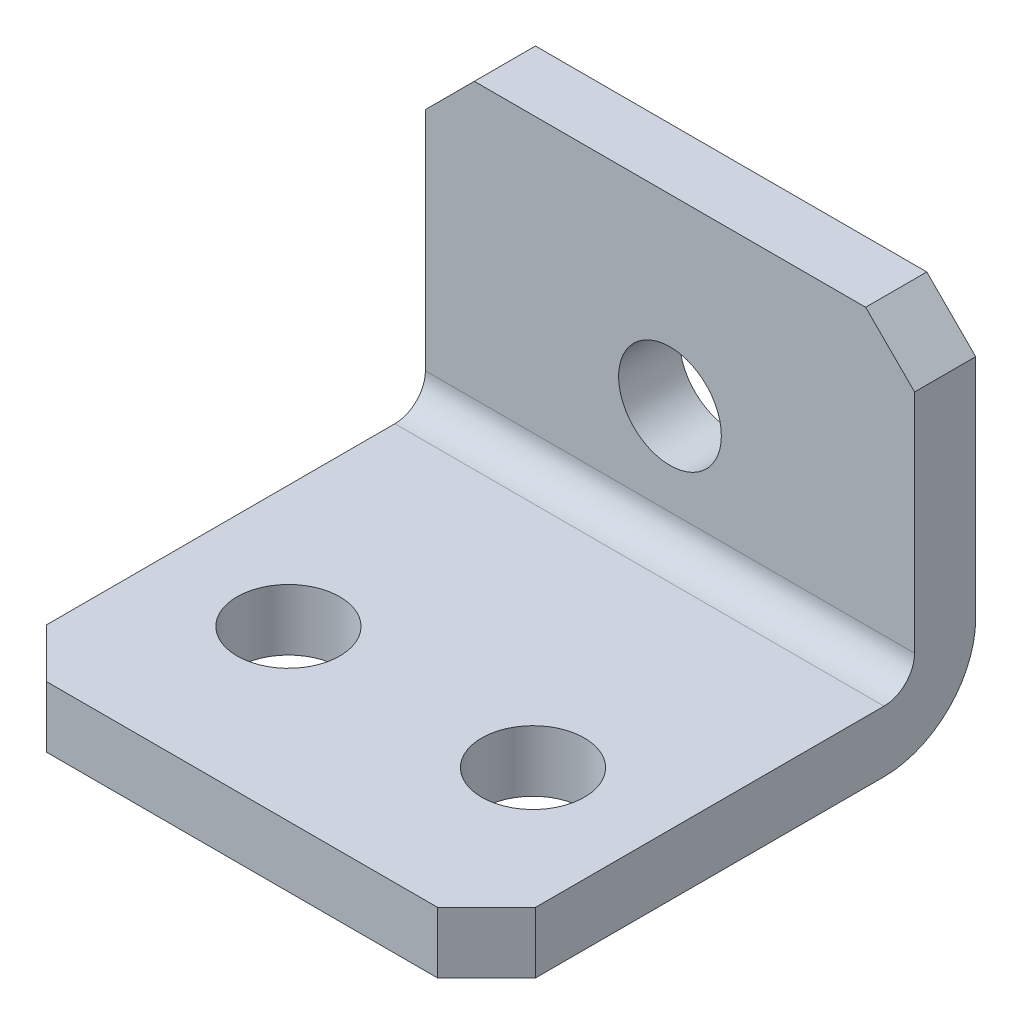
ISO-10303-21;
HEADER;
FILE_DESCRIPTION(('STEP AP214'),'2;1');
FILE_NAME('part.step','',(''),(''),'','','');
FILE_SCHEMA(('AUTOMOTIVE_DESIGN { 1 0 10303 214 1 1 1 1 }'));
ENDSEC;
DATA;
#1=APPLICATION_CONTEXT('core data for automotive mechanical design processes');
#2=APPLICATION_PROTOCOL_DEFINITION('international standard','automotive_design',2000,#1);
#3=PRODUCT_CONTEXT('',#1,'mechanical');
#4=PRODUCT('Part','Part','',(#3));
#5=PRODUCT_RELATED_PRODUCT_CATEGORY('part','',(#4));
#6=PRODUCT_DEFINITION_FORMATION('','',#4);
#7=PRODUCT_DEFINITION_CONTEXT('part definition',#1,'design');
#8=PRODUCT_DEFINITION('design','',#6,#7);
#9=PRODUCT_DEFINITION_SHAPE('','',#8);
#10=(LENGTH_UNIT() NAMED_UNIT(*) SI_UNIT(.MILLI.,.METRE.));
#11=(NAMED_UNIT(*) PLANE_ANGLE_UNIT() SI_UNIT($,.RADIAN.));
#12=(NAMED_UNIT(*) SI_UNIT($,.STERADIAN.) SOLID_ANGLE_UNIT());
#13=UNCERTAINTY_MEASURE_WITH_UNIT(LENGTH_MEASURE(1.E-05),#10,'distance_accuracy_value','');
#14=(GEOMETRIC_REPRESENTATION_CONTEXT(3) GLOBAL_UNCERTAINTY_ASSIGNED_CONTEXT((#13)) GLOBAL_UNIT_ASSIGNED_CONTEXT((#10,
#11,#12)) REPRESENTATION_CONTEXT('',''));
#15=CARTESIAN_POINT('',(0.,0.,0.));
#16=DIRECTION('',(0.,0.,1.));
#17=DIRECTION('',(1.,0.,0.));
#18=AXIS2_PLACEMENT_3D('',#15,#16,#17);
#19=CARTESIAN_POINT('',(0.,0.,3.17500000000001));
#20=DIRECTION('',(0.,0.,1.));
#21=DIRECTION('',(0.,-1.,0.));
#22=AXIS2_PLACEMENT_3D('',#19,#20,#21);
#23=PLANE('',#22);
#24=DIRECTION('',(0.,1.,0.));
#25=VECTOR('',#24,1.);
#26=CARTESIAN_POINT('',(-12.7,19.05,3.17499999999995));
#27=LINE('',#26,#25);
#28=CARTESIAN_POINT('',(-12.7,16.51,3.17499999999995));
#29=VERTEX_POINT('',#28);
#30=CARTESIAN_POINT('',(-12.7,4.7625,3.17499999999997));
#31=VERTEX_POINT('',#30);
#32=EDGE_CURVE('E119',#29,#31,#27,.F.);
#33=ORIENTED_EDGE('',*,*,#32,.T.);
#34=DIRECTION('',(-1.,0.,0.));
#35=VECTOR('',#34,1.);
#36=CARTESIAN_POINT('',(-12.7,4.76249999999998,3.17499999999999));
#37=LINE('',#36,#35);
#38=CARTESIAN_POINT('',(12.7,4.76249999999998,3.17499999999999));
#39=VERTEX_POINT('',#38);
#40=EDGE_CURVE('E116',#31,#39,#37,.F.);
#41=ORIENTED_EDGE('',*,*,#40,.T.);
#42=DIRECTION('',(0.,1.,0.));
#43=VECTOR('',#42,1.);
#44=CARTESIAN_POINT('',(12.7,3.17499999999999,3.17499999999999));
#45=LINE('',#44,#43);
#46=CARTESIAN_POINT('',(12.7,16.51,3.17499999999998));
#47=VERTEX_POINT('',#46);
#48=EDGE_CURVE('E103',#39,#47,#45,.T.);
#49=ORIENTED_EDGE('',*,*,#48,.T.);
#50=DIRECTION('',(0.707106781186549,-0.707106781186546,0.));
#51=VECTOR('',#50,1.);
#52=CARTESIAN_POINT('',(12.7,16.51,3.17499999999995));
#53=LINE('',#52,#51);
#54=CARTESIAN_POINT('',(10.16,19.05,3.17499999999995));
#55=VERTEX_POINT('',#54);
#56=EDGE_CURVE('E155',#47,#55,#53,.F.);
#57=ORIENTED_EDGE('',*,*,#56,.T.);
#58=DIRECTION('',(1.,0.,0.));
#59=VECTOR('',#58,1.);
#60=CARTESIAN_POINT('',(12.7,19.05,3.17499999999994));
#61=LINE('',#60,#59);
#62=CARTESIAN_POINT('',(-10.16,19.05,3.17499999999994));
#63=VERTEX_POINT('',#62);
#64=EDGE_CURVE('E113',#55,#63,#61,.F.);
#65=ORIENTED_EDGE('',*,*,#64,.T.);
#66=DIRECTION('',(0.707106781186546,0.70710678118655,0.));
#67=VECTOR('',#66,1.);
#68=CARTESIAN_POINT('',(-10.16,19.05,3.17499999999994));
#69=LINE('',#68,#67);
#70=EDGE_CURVE('E157',#63,#29,#69,.F.);
#71=ORIENTED_EDGE('',*,*,#70,.T.);
#72=EDGE_LOOP('',(#33,#41,#49,#57,#65,#71));
#73=FACE_BOUND('',#72,.T.);
#74=CARTESIAN_POINT('',(0.,9.52500000000001,3.17500000000001));
#75=DIRECTION('',(0.,0.,1.));
#76=DIRECTION('',(1.,0.,0.));
#77=AXIS2_PLACEMENT_3D('',#74,#75,#76);
#78=CIRCLE('',#77,2.667);
#79=CARTESIAN_POINT('',(2.667,9.52500000000001,3.17500000000001));
#80=VERTEX_POINT('',#79);
#81=EDGE_CURVE('E20',#80,#80,#78,.F.);
#82=ORIENTED_EDGE('',*,*,#81,.T.);
#83=EDGE_LOOP('',(#82));
#84=FACE_BOUND('',#83,.T.);
#85=ADVANCED_FACE('F17',(#73,#84),#23,.T.);
#86=CARTESIAN_POINT('',(0.,9.52500000000001,0.));
#87=DIRECTION('',(0.,0.,1.));
#88=DIRECTION('',(1.,0.,0.));
#89=AXIS2_PLACEMENT_3D('',#86,#87,#88);
#90=CYLINDRICAL_SURFACE('',#89,2.667);
#91=CARTESIAN_POINT('',(0.,9.52500000000001,0.));
#92=DIRECTION('',(0.,0.,1.));
#93=DIRECTION('',(1.,0.,0.));
#94=AXIS2_PLACEMENT_3D('',#91,#92,#93);
#95=CIRCLE('',#94,2.667);
#96=CARTESIAN_POINT('',(2.667,9.52500000000001,0.));
#97=VERTEX_POINT('',#96);
#98=EDGE_CURVE('E123',#97,#97,#95,.F.);
#99=ORIENTED_EDGE('',*,*,#98,.T.);
#100=EDGE_LOOP('',(#99));
#101=FACE_BOUND('',#100,.T.);
#102=ORIENTED_EDGE('',*,*,#81,.F.);
#103=EDGE_LOOP('',(#102));
#104=FACE_BOUND('',#103,.T.);
#105=ADVANCED_FACE('F295',(#101,#104),#90,.F.);
#106=CARTESIAN_POINT('',(-10.16,19.05,0.));
#107=DIRECTION('',(0.70710678118655,-0.707106781186546,0.));
#108=DIRECTION('',(0.707106781186546,0.70710678118655,0.));
#109=AXIS2_PLACEMENT_3D('',#106,#107,#108);
#110=PLANE('',#109);
#111=DIRECTION('',(0.,0.,-1.));
#112=VECTOR('',#111,1.);
#113=CARTESIAN_POINT('',(-12.7,16.51,0.));
#114=LINE('',#113,#112);
#115=CARTESIAN_POINT('',(-12.7,16.51,0.));
#116=VERTEX_POINT('',#115);
#117=EDGE_CURVE('E151',#116,#29,#114,.F.);
#118=ORIENTED_EDGE('',*,*,#117,.T.);
#119=ORIENTED_EDGE('',*,*,#70,.F.);
#120=DIRECTION('',(0.,0.,-1.));
#121=VECTOR('',#120,1.);
#122=CARTESIAN_POINT('',(-10.16,19.05,0.));
#123=LINE('',#122,#121);
#124=CARTESIAN_POINT('',(-10.16,19.05,0.));
#125=VERTEX_POINT('',#124);
#126=EDGE_CURVE('E153',#63,#125,#123,.T.);
#127=ORIENTED_EDGE('',*,*,#126,.T.);
#128=DIRECTION('',(-0.707106781186546,-0.707106781186549,0.));
#129=VECTOR('',#128,1.);
#130=CARTESIAN_POINT('',(-10.16,19.05,0.));
#131=LINE('',#130,#129);
#132=EDGE_CURVE('E137',#125,#116,#131,.T.);
#133=ORIENTED_EDGE('',*,*,#132,.T.);
#134=EDGE_LOOP('',(#118,#119,#127,#133));
#135=FACE_BOUND('',#134,.T.);
#136=ADVANCED_FACE('F293',(#135),#110,.F.);
#137=CARTESIAN_POINT('',(12.7,16.51,0.));
#138=DIRECTION('',(-0.707106781186546,-0.707106781186549,0.));
#139=DIRECTION('',(0.707106781186549,-0.707106781186546,0.));
#140=AXIS2_PLACEMENT_3D('',#137,#138,#139);
#141=PLANE('',#140);
#142=DIRECTION('',(0.,0.,-1.));
#143=VECTOR('',#142,1.);
#144=CARTESIAN_POINT('',(10.16,19.05,0.));
#145=LINE('',#144,#143);
#146=CARTESIAN_POINT('',(10.16,19.05,0.));
#147=VERTEX_POINT('',#146);
#148=EDGE_CURVE('E154',#147,#55,#145,.F.);
#149=ORIENTED_EDGE('',*,*,#148,.T.);
#150=ORIENTED_EDGE('',*,*,#56,.F.);
#151=DIRECTION('',(0.,0.,1.));
#152=VECTOR('',#151,1.);
#153=CARTESIAN_POINT('',(12.7,16.51,0.));
#154=LINE('',#153,#152);
#155=CARTESIAN_POINT('',(12.7,16.51,0.));
#156=VERTEX_POINT('',#155);
#157=EDGE_CURVE('E111',#47,#156,#154,.F.);
#158=ORIENTED_EDGE('',*,*,#157,.T.);
#159=DIRECTION('',(-0.707106781186549,0.707106781186546,0.));
#160=VECTOR('',#159,1.);
#161=CARTESIAN_POINT('',(12.7,16.51,0.));
#162=LINE('',#161,#160);
#163=EDGE_CURVE('E133',#156,#147,#162,.T.);
#164=ORIENTED_EDGE('',*,*,#163,.T.);
#165=EDGE_LOOP('',(#149,#150,#158,#164));
#166=FACE_BOUND('',#165,.T.);
#167=ADVANCED_FACE('F217',(#166),#141,.F.);
#168=CARTESIAN_POINT('',(12.7,19.05,0.));
#169=DIRECTION('',(0.,-1.,0.));
#170=DIRECTION('',(0.,0.,-1.));
#171=AXIS2_PLACEMENT_3D('',#168,#169,#170);
#172=PLANE('',#171);
#173=ORIENTED_EDGE('',*,*,#148,.F.);
#174=DIRECTION('',(1.,0.,0.));
#175=VECTOR('',#174,1.);
#176=CARTESIAN_POINT('',(0.,19.05,0.));
#177=LINE('',#176,#175);
#178=EDGE_CURVE('E129',#147,#125,#177,.F.);
#179=ORIENTED_EDGE('',*,*,#178,.T.);
#180=ORIENTED_EDGE('',*,*,#126,.F.);
#181=ORIENTED_EDGE('',*,*,#64,.F.);
#182=EDGE_LOOP('',(#173,#179,#180,#181));
#183=FACE_BOUND('',#182,.T.);
#184=ADVANCED_FACE('F287',(#183),#172,.F.);
#185=CARTESIAN_POINT('',(-12.7,4.76249999999998,4.76249999999999));
#186=DIRECTION('',(-1.,0.,0.));
#187=DIRECTION('',(0.,0.,1.));
#188=AXIS2_PLACEMENT_3D('',#185,#186,#187);
#189=CYLINDRICAL_SURFACE('',#188,1.5875);
#190=CARTESIAN_POINT('',(12.7,4.76249999999998,4.76249999999999));
#191=DIRECTION('',(-1.,0.,0.));
#192=DIRECTION('',(0.,0.,1.));
#193=AXIS2_PLACEMENT_3D('',#190,#191,#192);
#194=CIRCLE('',#193,1.5875);
#195=CARTESIAN_POINT('',(12.7,3.17499999999999,4.76249999999999));
#196=VERTEX_POINT('',#195);
#197=EDGE_CURVE('E108',#39,#196,#194,.T.);
#198=ORIENTED_EDGE('',*,*,#197,.F.);
#199=ORIENTED_EDGE('',*,*,#40,.F.);
#200=CARTESIAN_POINT('',(-12.7,4.76249999999998,4.76249999999999));
#201=DIRECTION('',(-1.,0.,0.));
#202=DIRECTION('',(0.,0.,1.));
#203=AXIS2_PLACEMENT_3D('',#200,#201,#202);
#204=CIRCLE('',#203,1.5875);
#205=CARTESIAN_POINT('',(-12.7,3.17499999999999,4.76249999999999));
#206=VERTEX_POINT('',#205);
#207=EDGE_CURVE('E128',#31,#206,#204,.T.);
#208=ORIENTED_EDGE('',*,*,#207,.T.);
#209=DIRECTION('',(1.,0.,0.));
#210=VECTOR('',#209,1.);
#211=CARTESIAN_POINT('',(0.,3.175,4.76249999999999));
#212=LINE('',#211,#210);
#213=EDGE_CURVE('E126',#196,#206,#212,.F.);
#214=ORIENTED_EDGE('',*,*,#213,.F.);
#215=EDGE_LOOP('',(#198,#199,#208,#214));
#216=FACE_BOUND('',#215,.T.);
#217=ADVANCED_FACE('F125',(#216),#189,.F.);
#218=CARTESIAN_POINT('',(0.,0.,0.));
#219=DIRECTION('',(0.,0.,1.));
#220=DIRECTION('',(0.,-1.,0.));
#221=AXIS2_PLACEMENT_3D('',#218,#219,#220);
#222=PLANE('',#221);
#223=ORIENTED_EDGE('',*,*,#163,.F.);
#224=DIRECTION('',(0.,-1.,0.));
#225=VECTOR('',#224,1.);
#226=CARTESIAN_POINT('',(12.7,0.,0.));
#227=LINE('',#226,#225);
#228=CARTESIAN_POINT('',(12.7,4.76249999999999,0.));
#229=VERTEX_POINT('',#228);
#230=EDGE_CURVE('E147',#229,#156,#227,.F.);
#231=ORIENTED_EDGE('',*,*,#230,.F.);
#232=DIRECTION('',(-1.,0.,0.));
#233=VECTOR('',#232,1.);
#234=CARTESIAN_POINT('',(-12.7,4.76250000000002,0.));
#235=LINE('',#234,#233);
#236=CARTESIAN_POINT('',(-12.7,4.76249999999999,0.));
#237=VERTEX_POINT('',#236);
#238=EDGE_CURVE('E175',#237,#229,#235,.F.);
#239=ORIENTED_EDGE('',*,*,#238,.F.);
#240=DIRECTION('',(0.,-1.,0.));
#241=VECTOR('',#240,1.);
#242=CARTESIAN_POINT('',(-12.7,0.,0.));
#243=LINE('',#242,#241);
#244=EDGE_CURVE('E141',#116,#237,#243,.T.);
#245=ORIENTED_EDGE('',*,*,#244,.F.);
#246=ORIENTED_EDGE('',*,*,#132,.F.);
#247=ORIENTED_EDGE('',*,*,#178,.F.);
#248=EDGE_LOOP('',(#223,#231,#239,#245,#246,#247));
#249=FACE_BOUND('',#248,.T.);
#250=ORIENTED_EDGE('',*,*,#98,.F.);
#251=EDGE_LOOP('',(#250));
#252=FACE_BOUND('',#251,.T.);
#253=ADVANCED_FACE('F220',(#249,#252),#222,.F.);
#254=CARTESIAN_POINT('',(0.,3.175,0.));
#255=DIRECTION('',(0.,1.,0.));
#256=DIRECTION('',(0.,0.,1.));
#257=AXIS2_PLACEMENT_3D('',#254,#255,#256);
#258=PLANE('',#257);
#259=DIRECTION('',(0.,0.,-1.));
#260=VECTOR('',#259,1.);
#261=CARTESIAN_POINT('',(12.7,3.175,0.));
#262=LINE('',#261,#260);
#263=CARTESIAN_POINT('',(12.7,3.175,22.86));
#264=VERTEX_POINT('',#263);
#265=EDGE_CURVE('E205',#196,#264,#262,.F.);
#266=ORIENTED_EDGE('',*,*,#265,.F.);
#267=ORIENTED_EDGE('',*,*,#213,.T.);
#268=DIRECTION('',(0.,0.,1.));
#269=VECTOR('',#268,1.);
#270=CARTESIAN_POINT('',(-12.7,3.175,0.));
#271=LINE('',#270,#269);
#272=CARTESIAN_POINT('',(-12.7,3.175,22.86));
#273=VERTEX_POINT('',#272);
#274=EDGE_CURVE('E174',#273,#206,#271,.F.);
#275=ORIENTED_EDGE('',*,*,#274,.F.);
#276=DIRECTION('',(-0.707106781186549,0.,-0.707106781186546));
#277=VECTOR('',#276,1.);
#278=CARTESIAN_POINT('',(-12.7,3.175,22.86));
#279=LINE('',#278,#277);
#280=CARTESIAN_POINT('',(-10.16,3.175,25.4));
#281=VERTEX_POINT('',#280);
#282=EDGE_CURVE('E193',#273,#281,#279,.F.);
#283=ORIENTED_EDGE('',*,*,#282,.T.);
#284=DIRECTION('',(1.,0.,0.));
#285=VECTOR('',#284,1.);
#286=CARTESIAN_POINT('',(-12.7,3.175,25.4));
#287=LINE('',#286,#285);
#288=CARTESIAN_POINT('',(10.16,3.175,25.4));
#289=VERTEX_POINT('',#288);
#290=EDGE_CURVE('E196',#289,#281,#287,.F.);
#291=ORIENTED_EDGE('',*,*,#290,.F.);
#292=DIRECTION('',(-0.707106781186546,0.,0.70710678118655));
#293=VECTOR('',#292,1.);
#294=CARTESIAN_POINT('',(10.16,3.175,25.4));
#295=LINE('',#294,#293);
#296=EDGE_CURVE('E181',#289,#264,#295,.F.);
#297=ORIENTED_EDGE('',*,*,#296,.T.);
#298=EDGE_LOOP('',(#266,#267,#275,#283,#291,#297));
#299=FACE_BOUND('',#298,.T.);
#300=CARTESIAN_POINT('',(-6.35,3.175,16.637));
#301=DIRECTION('',(0.,1.,0.));
#302=DIRECTION('',(0.,0.,1.));
#303=AXIS2_PLACEMENT_3D('',#300,#301,#302);
#304=CIRCLE('',#303,2.667);
#305=CARTESIAN_POINT('',(-6.35,3.175,19.304));
#306=VERTEX_POINT('',#305);
#307=EDGE_CURVE('E179',#306,#306,#304,.F.);
#308=ORIENTED_EDGE('',*,*,#307,.T.);
#309=EDGE_LOOP('',(#308));
#310=FACE_BOUND('',#309,.T.);
#311=CARTESIAN_POINT('',(6.35,3.175,16.637));
#312=DIRECTION('',(0.,1.,0.));
#313=DIRECTION('',(0.,0.,1.));
#314=AXIS2_PLACEMENT_3D('',#311,#312,#313);
#315=CIRCLE('',#314,2.667);
#316=CARTESIAN_POINT('',(6.35,3.175,19.304));
#317=VERTEX_POINT('',#316);
#318=EDGE_CURVE('E182',#317,#317,#315,.F.);
#319=ORIENTED_EDGE('',*,*,#318,.T.);
#320=EDGE_LOOP('',(#319));
#321=FACE_BOUND('',#320,.T.);
#322=ADVANCED_FACE('F251',(#299,#310,#321),#258,.T.);
#323=CARTESIAN_POINT('',(6.35,3.175,16.637));
#324=DIRECTION('',(0.,1.,0.));
#325=DIRECTION('',(0.,0.,1.));
#326=AXIS2_PLACEMENT_3D('',#323,#324,#325);
#327=CYLINDRICAL_SURFACE('',#326,2.667);
#328=CARTESIAN_POINT('',(6.35,0.,16.637));
#329=DIRECTION('',(0.,1.,0.));
#330=DIRECTION('',(0.,0.,1.));
#331=AXIS2_PLACEMENT_3D('',#328,#329,#330);
#332=CIRCLE('',#331,2.667);
#333=CARTESIAN_POINT('',(6.35,0.,19.304));
#334=VERTEX_POINT('',#333);
#335=EDGE_CURVE('E168',#334,#334,#332,.F.);
#336=ORIENTED_EDGE('',*,*,#335,.T.);
#337=EDGE_LOOP('',(#336));
#338=FACE_BOUND('',#337,.T.);
#339=ORIENTED_EDGE('',*,*,#318,.F.);
#340=EDGE_LOOP('',(#339));
#341=FACE_BOUND('',#340,.T.);
#342=ADVANCED_FACE('F276',(#338,#341),#327,.F.);
#343=CARTESIAN_POINT('',(-6.35,3.175,16.637));
#344=DIRECTION('',(0.,1.,0.));
#345=DIRECTION('',(0.,0.,1.));
#346=AXIS2_PLACEMENT_3D('',#343,#344,#345);
#347=CYLINDRICAL_SURFACE('',#346,2.667);
#348=CARTESIAN_POINT('',(-6.35,0.,16.637));
#349=DIRECTION('',(0.,1.,0.));
#350=DIRECTION('',(0.,0.,1.));
#351=AXIS2_PLACEMENT_3D('',#348,#349,#350);
#352=CIRCLE('',#351,2.667);
#353=CARTESIAN_POINT('',(-6.35,0.,19.304));
#354=VERTEX_POINT('',#353);
#355=EDGE_CURVE('E164',#354,#354,#352,.F.);
#356=ORIENTED_EDGE('',*,*,#355,.T.);
#357=EDGE_LOOP('',(#356));
#358=FACE_BOUND('',#357,.T.);
#359=ORIENTED_EDGE('',*,*,#307,.F.);
#360=EDGE_LOOP('',(#359));
#361=FACE_BOUND('',#360,.T.);
#362=ADVANCED_FACE('F273',(#358,#361),#347,.F.);
#363=CARTESIAN_POINT('',(10.16,3.175,25.4));
#364=DIRECTION('',(-0.70710678118655,0.,-0.707106781186546));
#365=DIRECTION('',(-0.707106781186546,0.,0.70710678118655));
#366=AXIS2_PLACEMENT_3D('',#363,#364,#365);
#367=PLANE('',#366);
#368=DIRECTION('',(0.,1.,0.));
#369=VECTOR('',#368,1.);
#370=CARTESIAN_POINT('',(12.7,3.175,22.86));
#371=LINE('',#370,#369);
#372=CARTESIAN_POINT('',(12.7,0.,22.86));
#373=VERTEX_POINT('',#372);
#374=EDGE_CURVE('E178',#264,#373,#371,.F.);
#375=ORIENTED_EDGE('',*,*,#374,.F.);
#376=ORIENTED_EDGE('',*,*,#296,.F.);
#377=DIRECTION('',(0.,1.,0.));
#378=VECTOR('',#377,1.);
#379=CARTESIAN_POINT('',(10.16,3.175,25.4));
#380=LINE('',#379,#378);
#381=CARTESIAN_POINT('',(10.16,0.,25.4));
#382=VERTEX_POINT('',#381);
#383=EDGE_CURVE('E171',#382,#289,#380,.T.);
#384=ORIENTED_EDGE('',*,*,#383,.F.);
#385=DIRECTION('',(0.707106781186546,0.,-0.707106781186549));
#386=VECTOR('',#385,1.);
#387=CARTESIAN_POINT('',(10.16,0.,25.4));
#388=LINE('',#387,#386);
#389=EDGE_CURVE('E167',#382,#373,#388,.T.);
#390=ORIENTED_EDGE('',*,*,#389,.T.);
#391=EDGE_LOOP('',(#375,#376,#384,#390));
#392=FACE_BOUND('',#391,.T.);
#393=ADVANCED_FACE('F246',(#392),#367,.F.);
#394=CARTESIAN_POINT('',(12.7,3.175,0.));
#395=DIRECTION('',(1.,0.,0.));
#396=DIRECTION('',(0.,0.,-1.));
#397=AXIS2_PLACEMENT_3D('',#394,#395,#396);
#398=PLANE('',#397);
#399=DIRECTION('',(0.,0.,1.));
#400=VECTOR('',#399,1.);
#401=CARTESIAN_POINT('',(12.7,0.,0.));
#402=LINE('',#401,#400);
#403=CARTESIAN_POINT('',(12.7,0.,4.76249999999999));
#404=VERTEX_POINT('',#403);
#405=EDGE_CURVE('E202',#373,#404,#402,.F.);
#406=ORIENTED_EDGE('',*,*,#405,.T.);
#407=CARTESIAN_POINT('',(12.7,4.76249999999998,4.76249999999999));
#408=DIRECTION('',(-1.,0.,0.));
#409=DIRECTION('',(0.,0.,1.));
#410=AXIS2_PLACEMENT_3D('',#407,#408,#409);
#411=CIRCLE('',#410,4.7625);
#412=EDGE_CURVE('E172',#229,#404,#411,.T.);
#413=ORIENTED_EDGE('',*,*,#412,.F.);
#414=ORIENTED_EDGE('',*,*,#230,.T.);
#415=ORIENTED_EDGE('',*,*,#157,.F.);
#416=ORIENTED_EDGE('',*,*,#48,.F.);
#417=ORIENTED_EDGE('',*,*,#197,.T.);
#418=ORIENTED_EDGE('',*,*,#265,.T.);
#419=ORIENTED_EDGE('',*,*,#374,.T.);
#420=EDGE_LOOP('',(#406,#413,#414,#415,#416,#417,#418,#419));
#421=FACE_BOUND('',#420,.T.);
#422=ADVANCED_FACE('F106',(#421),#398,.T.);
#423=CARTESIAN_POINT('',(-12.7,4.76249999999998,4.76249999999999));
#424=DIRECTION('',(-1.,0.,0.));
#425=DIRECTION('',(0.,0.,1.));
#426=AXIS2_PLACEMENT_3D('',#423,#424,#425);
#427=CYLINDRICAL_SURFACE('',#426,4.7625);
#428=ORIENTED_EDGE('',*,*,#238,.T.);
#429=ORIENTED_EDGE('',*,*,#412,.T.);
#430=DIRECTION('',(1.,0.,0.));
#431=VECTOR('',#430,1.);
#432=CARTESIAN_POINT('',(0.,0.,4.76249999999999));
#433=LINE('',#432,#431);
#434=CARTESIAN_POINT('',(-12.7,0.,4.76249999999999));
#435=VERTEX_POINT('',#434);
#436=EDGE_CURVE('E191',#404,#435,#433,.F.);
#437=ORIENTED_EDGE('',*,*,#436,.T.);
#438=CARTESIAN_POINT('',(-12.7,4.76249999999998,4.76249999999999));
#439=DIRECTION('',(-1.,0.,0.));
#440=DIRECTION('',(0.,0.,1.));
#441=AXIS2_PLACEMENT_3D('',#438,#439,#440);
#442=CIRCLE('',#441,4.7625);
#443=EDGE_CURVE('E176',#435,#237,#442,.F.);
#444=ORIENTED_EDGE('',*,*,#443,.T.);
#445=EDGE_LOOP('',(#428,#429,#437,#444));
#446=FACE_BOUND('',#445,.T.);
#447=ADVANCED_FACE('F228',(#446),#427,.T.);
#448=CARTESIAN_POINT('',(-12.7,3.175,0.));
#449=DIRECTION('',(-1.,0.,0.));
#450=DIRECTION('',(0.,0.,1.));
#451=AXIS2_PLACEMENT_3D('',#448,#449,#450);
#452=PLANE('',#451);
#453=ORIENTED_EDGE('',*,*,#274,.T.);
#454=ORIENTED_EDGE('',*,*,#207,.F.);
#455=ORIENTED_EDGE('',*,*,#32,.F.);
#456=ORIENTED_EDGE('',*,*,#117,.F.);
#457=ORIENTED_EDGE('',*,*,#244,.T.);
#458=ORIENTED_EDGE('',*,*,#443,.F.);
#459=DIRECTION('',(0.,0.,1.));
#460=VECTOR('',#459,1.);
#461=CARTESIAN_POINT('',(-12.7,0.,0.));
#462=LINE('',#461,#460);
#463=CARTESIAN_POINT('',(-12.7,0.,22.86));
#464=VERTEX_POINT('',#463);
#465=EDGE_CURVE('E236',#435,#464,#462,.T.);
#466=ORIENTED_EDGE('',*,*,#465,.T.);
#467=DIRECTION('',(0.,1.,0.));
#468=VECTOR('',#467,1.);
#469=CARTESIAN_POINT('',(-12.7,3.175,22.86));
#470=LINE('',#469,#468);
#471=EDGE_CURVE('E197',#464,#273,#470,.T.);
#472=ORIENTED_EDGE('',*,*,#471,.T.);
#473=EDGE_LOOP('',(#453,#454,#455,#456,#457,#458,#466,#472));
#474=FACE_BOUND('',#473,.T.);
#475=ADVANCED_FACE('F250',(#474),#452,.T.);
#476=CARTESIAN_POINT('',(-12.7,3.175,22.86));
#477=DIRECTION('',(0.707106781186546,0.,-0.707106781186549));
#478=DIRECTION('',(-0.707106781186549,0.,-0.707106781186546));
#479=AXIS2_PLACEMENT_3D('',#476,#477,#478);
#480=PLANE('',#479);
#481=DIRECTION('',(0.,1.,0.));
#482=VECTOR('',#481,1.);
#483=CARTESIAN_POINT('',(-10.16,3.175,25.4));
#484=LINE('',#483,#482);
#485=CARTESIAN_POINT('',(-10.16,0.,25.4));
#486=VERTEX_POINT('',#485);
#487=EDGE_CURVE('E34',#281,#486,#484,.F.);
#488=ORIENTED_EDGE('',*,*,#487,.F.);
#489=ORIENTED_EDGE('',*,*,#282,.F.);
#490=ORIENTED_EDGE('',*,*,#471,.F.);
#491=DIRECTION('',(0.707106781186549,0.,0.707106781186546));
#492=VECTOR('',#491,1.);
#493=CARTESIAN_POINT('',(-12.7,0.,22.86));
#494=LINE('',#493,#492);
#495=EDGE_CURVE('E26',#464,#486,#494,.T.);
#496=ORIENTED_EDGE('',*,*,#495,.T.);
#497=EDGE_LOOP('',(#488,#489,#490,#496));
#498=FACE_BOUND('',#497,.T.);
#499=ADVANCED_FACE('F248',(#498),#480,.F.);
#500=CARTESIAN_POINT('',(-12.7,3.175,25.4));
#501=DIRECTION('',(0.,0.,1.));
#502=DIRECTION('',(1.,0.,0.));
#503=AXIS2_PLACEMENT_3D('',#500,#501,#502);
#504=PLANE('',#503);
#505=DIRECTION('',(1.,0.,0.));
#506=VECTOR('',#505,1.);
#507=CARTESIAN_POINT('',(0.,0.,25.4));
#508=LINE('',#507,#506);
#509=EDGE_CURVE('E10',#486,#382,#508,.T.);
#510=ORIENTED_EDGE('',*,*,#509,.T.);
#511=ORIENTED_EDGE('',*,*,#383,.T.);
#512=ORIENTED_EDGE('',*,*,#290,.T.);
#513=ORIENTED_EDGE('',*,*,#487,.T.);
#514=EDGE_LOOP('',(#510,#511,#512,#513));
#515=FACE_BOUND('',#514,.T.);
#516=ADVANCED_FACE('F254',(#515),#504,.T.);
#517=CARTESIAN_POINT('',(0.,0.,0.));
#518=DIRECTION('',(0.,1.,0.));
#519=DIRECTION('',(0.,0.,1.));
#520=AXIS2_PLACEMENT_3D('',#517,#518,#519);
#521=PLANE('',#520);
#522=ORIENTED_EDGE('',*,*,#495,.F.);
#523=ORIENTED_EDGE('',*,*,#465,.F.);
#524=ORIENTED_EDGE('',*,*,#436,.F.);
#525=ORIENTED_EDGE('',*,*,#405,.F.);
#526=ORIENTED_EDGE('',*,*,#389,.F.);
#527=ORIENTED_EDGE('',*,*,#509,.F.);
#528=EDGE_LOOP('',(#522,#523,#524,#525,#526,#527));
#529=FACE_BOUND('',#528,.T.);
#530=ORIENTED_EDGE('',*,*,#355,.F.);
#531=EDGE_LOOP('',(#530));
#532=FACE_BOUND('',#531,.T.);
#533=ORIENTED_EDGE('',*,*,#335,.F.);
#534=EDGE_LOOP('',(#533));
#535=FACE_BOUND('',#534,.T.);
#536=ADVANCED_FACE('F232',(#529,#532,#535),#521,.F.);
#537=CLOSED_SHELL('',(#85,#105,#136,#167,#184,#217,#253,#322,#342,#362,#393,#422,#447,#475,#499,
#516,#536));
#538=MANIFOLD_SOLID_BREP('B1',#537);
#539=ADVANCED_BREP_SHAPE_REPRESENTATION('',(#18,#538),#14);
#540=SHAPE_DEFINITION_REPRESENTATION(#9,#539);
ENDSEC;
END-ISO-10303-21;
